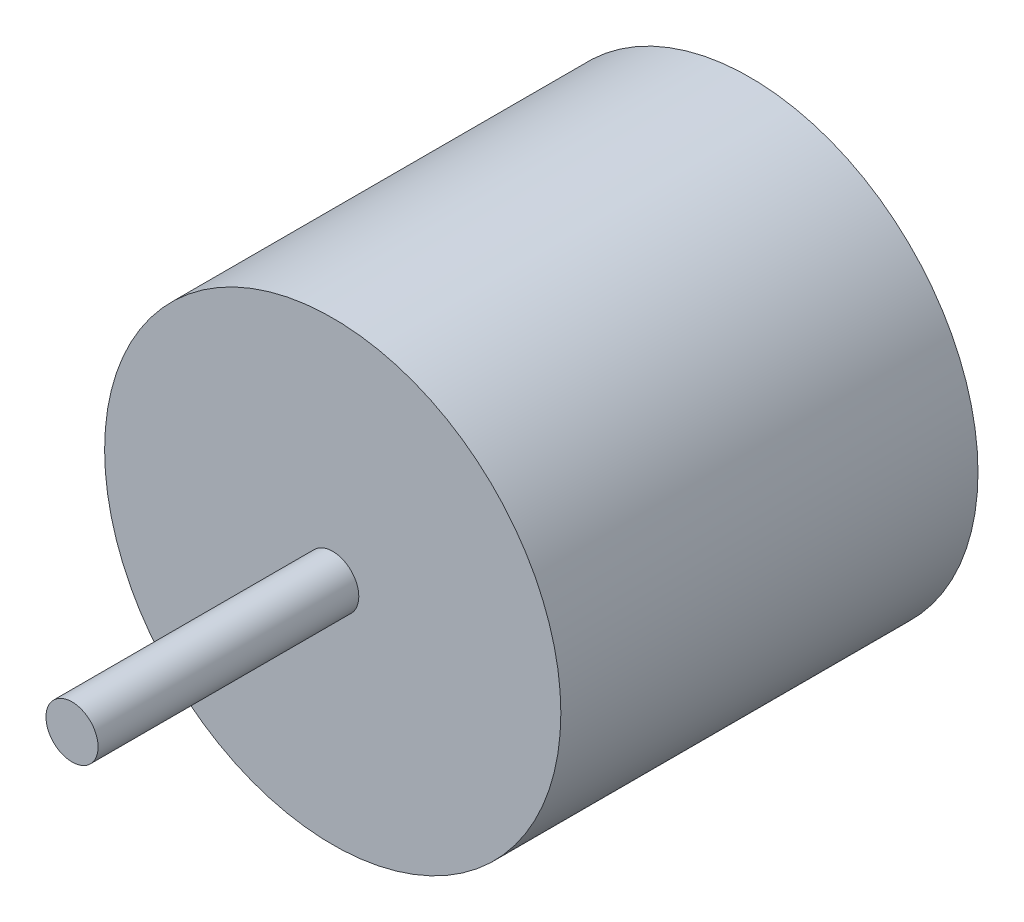
ISO-10303-21;
HEADER;
FILE_DESCRIPTION(('STEP AP214'),'2;1');
FILE_NAME('part.step','',(''),(''),'','','');
FILE_SCHEMA(('AUTOMOTIVE_DESIGN { 1 0 10303 214 1 1 1 1 }'));
ENDSEC;
DATA;
#1=APPLICATION_CONTEXT('core data for automotive mechanical design processes');
#2=APPLICATION_PROTOCOL_DEFINITION('international standard','automotive_design',2000,#1);
#3=PRODUCT_CONTEXT('',#1,'mechanical');
#4=PRODUCT('Part','Part','',(#3));
#5=PRODUCT_RELATED_PRODUCT_CATEGORY('part','',(#4));
#6=PRODUCT_DEFINITION_FORMATION('','',#4);
#7=PRODUCT_DEFINITION_CONTEXT('part definition',#1,'design');
#8=PRODUCT_DEFINITION('design','',#6,#7);
#9=PRODUCT_DEFINITION_SHAPE('','',#8);
#10=(LENGTH_UNIT() NAMED_UNIT(*) SI_UNIT(.MILLI.,.METRE.));
#11=(NAMED_UNIT(*) PLANE_ANGLE_UNIT() SI_UNIT($,.RADIAN.));
#12=(NAMED_UNIT(*) SI_UNIT($,.STERADIAN.) SOLID_ANGLE_UNIT());
#13=UNCERTAINTY_MEASURE_WITH_UNIT(LENGTH_MEASURE(1.E-05),#10,'distance_accuracy_value','');
#14=(GEOMETRIC_REPRESENTATION_CONTEXT(3) GLOBAL_UNCERTAINTY_ASSIGNED_CONTEXT((#13)) GLOBAL_UNIT_ASSIGNED_CONTEXT((#10,
#11,#12)) REPRESENTATION_CONTEXT('',''));
#15=CARTESIAN_POINT('',(0.,0.,0.));
#16=DIRECTION('',(0.,0.,1.));
#17=DIRECTION('',(1.,0.,0.));
#18=AXIS2_PLACEMENT_3D('',#15,#16,#17);
#19=CARTESIAN_POINT('',(0.,0.,32.));
#20=DIRECTION('',(0.,0.,-1.));
#21=DIRECTION('',(-1.,0.,0.));
#22=AXIS2_PLACEMENT_3D('',#19,#20,#21);
#23=CYLINDRICAL_SURFACE('',#22,17.5);
#24=CARTESIAN_POINT('',(0.,0.,32.));
#25=DIRECTION('',(0.,0.,1.));
#26=DIRECTION('',(1.,0.,0.));
#27=AXIS2_PLACEMENT_3D('',#24,#25,#26);
#28=CIRCLE('',#27,17.5);
#29=CARTESIAN_POINT('',(17.5,0.,32.));
#30=VERTEX_POINT('',#29);
#31=EDGE_CURVE('E10',#30,#30,#28,.T.);
#32=ORIENTED_EDGE('',*,*,#31,.F.);
#33=EDGE_LOOP('',(#32));
#34=FACE_BOUND('',#33,.T.);
#35=CARTESIAN_POINT('',(0.,0.,0.));
#36=DIRECTION('',(0.,0.,1.));
#37=DIRECTION('',(1.,0.,0.));
#38=AXIS2_PLACEMENT_3D('',#35,#36,#37);
#39=CIRCLE('',#38,17.5);
#40=CARTESIAN_POINT('',(17.5,0.,0.));
#41=VERTEX_POINT('',#40);
#42=EDGE_CURVE('E40',#41,#41,#39,.T.);
#43=ORIENTED_EDGE('',*,*,#42,.T.);
#44=EDGE_LOOP('',(#43));
#45=FACE_BOUND('',#44,.T.);
#46=ADVANCED_FACE('F37',(#34,#45),#23,.T.);
#47=CARTESIAN_POINT('',(0.,0.,32.));
#48=DIRECTION('',(0.,0.,1.));
#49=DIRECTION('',(1.,0.,0.));
#50=AXIS2_PLACEMENT_3D('',#47,#48,#49);
#51=PLANE('',#50);
#52=CARTESIAN_POINT('',(0.,0.,32.));
#53=DIRECTION('',(0.,0.,1.));
#54=DIRECTION('',(1.,0.,0.));
#55=AXIS2_PLACEMENT_3D('',#52,#53,#54);
#56=CIRCLE('',#55,2.);
#57=CARTESIAN_POINT('',(2.,0.,32.));
#58=VERTEX_POINT('',#57);
#59=EDGE_CURVE('E52',#58,#58,#56,.T.);
#60=ORIENTED_EDGE('',*,*,#59,.F.);
#61=EDGE_LOOP('',(#60));
#62=FACE_BOUND('',#61,.T.);
#63=ORIENTED_EDGE('',*,*,#31,.T.);
#64=EDGE_LOOP('',(#63));
#65=FACE_BOUND('',#64,.T.);
#66=ADVANCED_FACE('F72',(#62,#65),#51,.T.);
#67=CARTESIAN_POINT('',(0.,0.,0.));
#68=DIRECTION('',(0.,0.,1.));
#69=DIRECTION('',(1.,0.,0.));
#70=AXIS2_PLACEMENT_3D('',#67,#68,#69);
#71=PLANE('',#70);
#72=ORIENTED_EDGE('',*,*,#42,.F.);
#73=EDGE_LOOP('',(#72));
#74=FACE_BOUND('',#73,.T.);
#75=ADVANCED_FACE('F68',(#74),#71,.F.);
#76=CARTESIAN_POINT('',(0.,0.,52.));
#77=DIRECTION('',(0.,0.,-1.));
#78=DIRECTION('',(-1.,0.,0.));
#79=AXIS2_PLACEMENT_3D('',#76,#77,#78);
#80=CYLINDRICAL_SURFACE('',#79,2.);
#81=CARTESIAN_POINT('',(0.,0.,52.));
#82=DIRECTION('',(0.,0.,1.));
#83=DIRECTION('',(1.,0.,0.));
#84=AXIS2_PLACEMENT_3D('',#81,#82,#83);
#85=CIRCLE('',#84,2.);
#86=CARTESIAN_POINT('',(2.,0.,52.));
#87=VERTEX_POINT('',#86);
#88=EDGE_CURVE('E50',#87,#87,#85,.T.);
#89=ORIENTED_EDGE('',*,*,#88,.F.);
#90=EDGE_LOOP('',(#89));
#91=FACE_BOUND('',#90,.T.);
#92=ORIENTED_EDGE('',*,*,#59,.T.);
#93=EDGE_LOOP('',(#92));
#94=FACE_BOUND('',#93,.T.);
#95=ADVANCED_FACE('F65',(#91,#94),#80,.T.);
#96=CARTESIAN_POINT('',(0.,0.,52.));
#97=DIRECTION('',(0.,0.,1.));
#98=DIRECTION('',(1.,0.,0.));
#99=AXIS2_PLACEMENT_3D('',#96,#97,#98);
#100=PLANE('',#99);
#101=ORIENTED_EDGE('',*,*,#88,.T.);
#102=EDGE_LOOP('',(#101));
#103=FACE_BOUND('',#102,.T.);
#104=ADVANCED_FACE('F63',(#103),#100,.T.);
#105=CLOSED_SHELL('',(#46,#66,#75,#95,#104));
#106=MANIFOLD_SOLID_BREP('B2',#105);
#107=ADVANCED_BREP_SHAPE_REPRESENTATION('',(#18,#106),#14);
#108=SHAPE_DEFINITION_REPRESENTATION(#9,#107);
ENDSEC;
END-ISO-10303-21;
